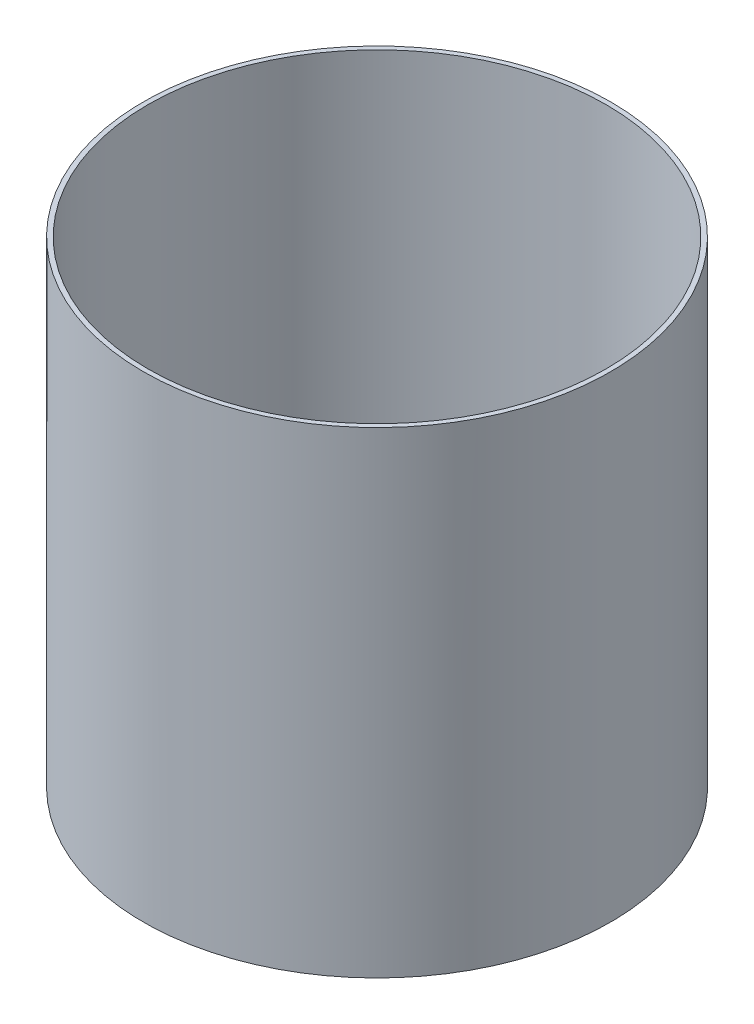
ISO-10303-21;
HEADER;
FILE_DESCRIPTION(('STEP AP214'),'2;1');
FILE_NAME('part.step','',(''),(''),'','','');
FILE_SCHEMA(('AUTOMOTIVE_DESIGN { 1 0 10303 214 1 1 1 1 }'));
ENDSEC;
DATA;
#1=APPLICATION_CONTEXT('core data for automotive mechanical design processes');
#2=APPLICATION_PROTOCOL_DEFINITION('international standard','automotive_design',2000,#1);
#3=PRODUCT_CONTEXT('',#1,'mechanical');
#4=PRODUCT('Part','Part','',(#3));
#5=PRODUCT_RELATED_PRODUCT_CATEGORY('part','',(#4));
#6=PRODUCT_DEFINITION_FORMATION('','',#4);
#7=PRODUCT_DEFINITION_CONTEXT('part definition',#1,'design');
#8=PRODUCT_DEFINITION('design','',#6,#7);
#9=PRODUCT_DEFINITION_SHAPE('','',#8);
#10=(LENGTH_UNIT() NAMED_UNIT(*) SI_UNIT(.MILLI.,.METRE.));
#11=(NAMED_UNIT(*) PLANE_ANGLE_UNIT() SI_UNIT($,.RADIAN.));
#12=(NAMED_UNIT(*) SI_UNIT($,.STERADIAN.) SOLID_ANGLE_UNIT());
#13=UNCERTAINTY_MEASURE_WITH_UNIT(LENGTH_MEASURE(1.E-05),#10,'distance_accuracy_value','');
#14=(GEOMETRIC_REPRESENTATION_CONTEXT(3) GLOBAL_UNCERTAINTY_ASSIGNED_CONTEXT((#13)) GLOBAL_UNIT_ASSIGNED_CONTEXT((#10,
#11,#12)) REPRESENTATION_CONTEXT('',''));
#15=CARTESIAN_POINT('',(0.,0.,0.));
#16=DIRECTION('',(0.,0.,1.));
#17=DIRECTION('',(1.,0.,0.));
#18=AXIS2_PLACEMENT_3D('',#15,#16,#17);
#19=CARTESIAN_POINT('',(0.,100.,0.));
#20=DIRECTION('',(0.,1.,0.));
#21=DIRECTION('',(0.,0.,1.));
#22=AXIS2_PLACEMENT_3D('',#19,#20,#21);
#23=PLANE('',#22);
#24=CARTESIAN_POINT('',(0.,100.,0.));
#25=DIRECTION('',(0.,1.,0.));
#26=DIRECTION('',(0.,0.,1.));
#27=AXIS2_PLACEMENT_3D('',#24,#25,#26);
#28=CIRCLE('',#27,50.);
#29=CARTESIAN_POINT('',(0.,100.,50.));
#30=VERTEX_POINT('',#29);
#31=EDGE_CURVE('E10',#30,#30,#28,.T.);
#32=ORIENTED_EDGE('',*,*,#31,.T.);
#33=EDGE_LOOP('',(#32));
#34=FACE_BOUND('',#33,.T.);
#35=CARTESIAN_POINT('',(0.,100.,0.));
#36=DIRECTION('',(0.,1.,0.));
#37=DIRECTION('',(0.,0.,1.));
#38=AXIS2_PLACEMENT_3D('',#35,#36,#37);
#39=CIRCLE('',#38,49.);
#40=CARTESIAN_POINT('',(0.,100.,49.));
#41=VERTEX_POINT('',#40);
#42=EDGE_CURVE('E51',#41,#41,#39,.T.);
#43=ORIENTED_EDGE('',*,*,#42,.F.);
#44=EDGE_LOOP('',(#43));
#45=FACE_BOUND('',#44,.T.);
#46=ADVANCED_FACE('F43',(#34,#45),#23,.T.);
#47=CARTESIAN_POINT('',(0.,100.,0.));
#48=DIRECTION('',(0.,-1.,0.));
#49=DIRECTION('',(0.,0.,-1.));
#50=AXIS2_PLACEMENT_3D('',#47,#48,#49);
#51=CYLINDRICAL_SURFACE('',#50,50.);
#52=ORIENTED_EDGE('',*,*,#31,.F.);
#53=EDGE_LOOP('',(#52));
#54=FACE_BOUND('',#53,.T.);
#55=CARTESIAN_POINT('',(0.,-2.,0.));
#56=DIRECTION('',(0.,-1.,0.));
#57=DIRECTION('',(0.,0.,-1.));
#58=AXIS2_PLACEMENT_3D('',#55,#56,#57);
#59=CIRCLE('',#58,50.);
#60=CARTESIAN_POINT('',(0.,-2.,-50.));
#61=VERTEX_POINT('',#60);
#62=EDGE_CURVE('E62',#61,#61,#59,.T.);
#63=ORIENTED_EDGE('',*,*,#62,.F.);
#64=EDGE_LOOP('',(#63));
#65=FACE_BOUND('',#64,.T.);
#66=ADVANCED_FACE('F45',(#54,#65),#51,.T.);
#67=CARTESIAN_POINT('',(0.,100.,0.));
#68=DIRECTION('',(0.,-1.,0.));
#69=DIRECTION('',(0.,0.,-1.));
#70=AXIS2_PLACEMENT_3D('',#67,#68,#69);
#71=CYLINDRICAL_SURFACE('',#70,49.);
#72=ORIENTED_EDGE('',*,*,#42,.T.);
#73=EDGE_LOOP('',(#72));
#74=FACE_BOUND('',#73,.T.);
#75=CARTESIAN_POINT('',(0.,0.,0.));
#76=DIRECTION('',(0.,1.,0.));
#77=DIRECTION('',(0.,0.,1.));
#78=AXIS2_PLACEMENT_3D('',#75,#76,#77);
#79=CIRCLE('',#78,49.);
#80=CARTESIAN_POINT('',(0.,0.,49.));
#81=VERTEX_POINT('',#80);
#82=EDGE_CURVE('E56',#81,#81,#79,.T.);
#83=ORIENTED_EDGE('',*,*,#82,.F.);
#84=EDGE_LOOP('',(#83));
#85=FACE_BOUND('',#84,.T.);
#86=ADVANCED_FACE('F71',(#74,#85),#71,.F.);
#87=CARTESIAN_POINT('',(0.,0.,0.));
#88=DIRECTION('',(0.,-1.,0.));
#89=DIRECTION('',(0.,0.,-1.));
#90=AXIS2_PLACEMENT_3D('',#87,#88,#89);
#91=PLANE('',#90);
#92=ORIENTED_EDGE('',*,*,#82,.T.);
#93=EDGE_LOOP('',(#92));
#94=FACE_BOUND('',#93,.T.);
#95=ADVANCED_FACE('F77',(#94),#91,.F.);
#96=CARTESIAN_POINT('',(0.,-2.,0.));
#97=DIRECTION('',(0.,-1.,0.));
#98=DIRECTION('',(0.,0.,-1.));
#99=AXIS2_PLACEMENT_3D('',#96,#97,#98);
#100=PLANE('',#99);
#101=ORIENTED_EDGE('',*,*,#62,.T.);
#102=EDGE_LOOP('',(#101));
#103=FACE_BOUND('',#102,.T.);
#104=ADVANCED_FACE('F68',(#103),#100,.T.);
#105=CLOSED_SHELL('',(#46,#66,#86,#95,#104));
#106=MANIFOLD_SOLID_BREP('B2',#105);
#107=ADVANCED_BREP_SHAPE_REPRESENTATION('',(#18,#106),#14);
#108=SHAPE_DEFINITION_REPRESENTATION(#9,#107);
ENDSEC;
END-ISO-10303-21;
